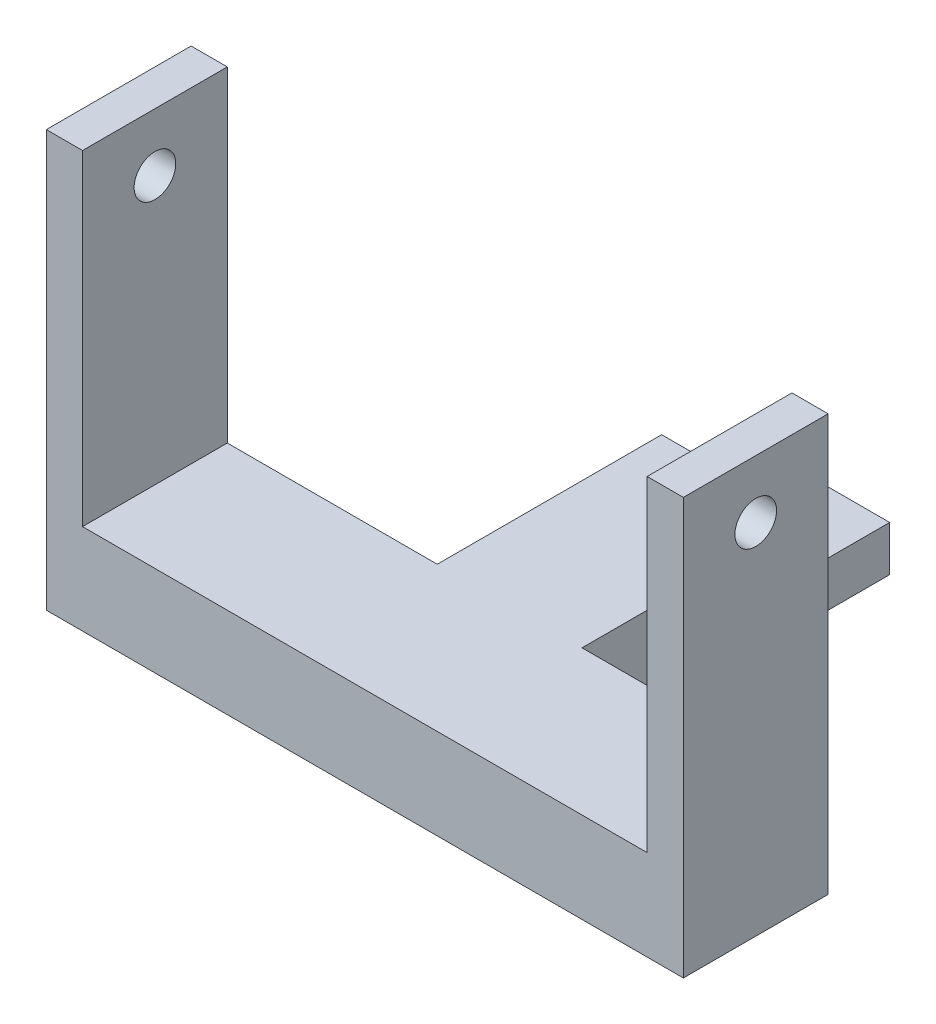
ISO-10303-21;
HEADER;
FILE_DESCRIPTION(('STEP AP214'),'2;1');
FILE_NAME('part.step','',(''),(''),'','','');
FILE_SCHEMA(('AUTOMOTIVE_DESIGN { 1 0 10303 214 1 1 1 1 }'));
ENDSEC;
DATA;
#1=APPLICATION_CONTEXT('core data for automotive mechanical design processes');
#2=APPLICATION_PROTOCOL_DEFINITION('international standard','automotive_design',2000,#1);
#3=PRODUCT_CONTEXT('',#1,'mechanical');
#4=PRODUCT('Part','Part','',(#3));
#5=PRODUCT_RELATED_PRODUCT_CATEGORY('part','',(#4));
#6=PRODUCT_DEFINITION_FORMATION('','',#4);
#7=PRODUCT_DEFINITION_CONTEXT('part definition',#1,'design');
#8=PRODUCT_DEFINITION('design','',#6,#7);
#9=PRODUCT_DEFINITION_SHAPE('','',#8);
#10=(LENGTH_UNIT() NAMED_UNIT(*) SI_UNIT(.MILLI.,.METRE.));
#11=(NAMED_UNIT(*) PLANE_ANGLE_UNIT() SI_UNIT($,.RADIAN.));
#12=(NAMED_UNIT(*) SI_UNIT($,.STERADIAN.) SOLID_ANGLE_UNIT());
#13=UNCERTAINTY_MEASURE_WITH_UNIT(LENGTH_MEASURE(1.E-05),#10,'distance_accuracy_value','');
#14=(GEOMETRIC_REPRESENTATION_CONTEXT(3) GLOBAL_UNCERTAINTY_ASSIGNED_CONTEXT((#13)) GLOBAL_UNIT_ASSIGNED_CONTEXT((#10,
#11,#12)) REPRESENTATION_CONTEXT('',''));
#15=CARTESIAN_POINT('',(0.,0.,0.));
#16=DIRECTION('',(0.,0.,1.));
#17=DIRECTION('',(1.,0.,0.));
#18=AXIS2_PLACEMENT_3D('',#15,#16,#17);
#19=CARTESIAN_POINT('',(88.,20.,-20.));
#20=DIRECTION('',(0.,0.,1.));
#21=DIRECTION('',(1.,0.,0.));
#22=AXIS2_PLACEMENT_3D('',#19,#20,#21);
#23=PLANE('',#22);
#24=DIRECTION('',(-1.,0.,0.));
#25=VECTOR('',#24,1.);
#26=CARTESIAN_POINT('',(-78.,10.,-20.));
#27=LINE('',#26,#25);
#28=CARTESIAN_POINT('',(78.,10.,-20.));
#29=VERTEX_POINT('',#28);
#30=CARTESIAN_POINT('',(20.,10.,-20.));
#31=VERTEX_POINT('',#30);
#32=EDGE_CURVE('E166',#29,#31,#27,.T.);
#33=ORIENTED_EDGE('',*,*,#32,.F.);
#34=DIRECTION('',(0.,1.,0.));
#35=VECTOR('',#34,1.);
#36=CARTESIAN_POINT('',(78.,20.,-20.));
#37=LINE('',#36,#35);
#38=CARTESIAN_POINT('',(78.,100.,-20.));
#39=VERTEX_POINT('',#38);
#40=EDGE_CURVE('E260',#29,#39,#37,.T.);
#41=ORIENTED_EDGE('',*,*,#40,.T.);
#42=DIRECTION('',(-1.,0.,0.));
#43=VECTOR('',#42,1.);
#44=CARTESIAN_POINT('',(78.,100.,-20.));
#45=LINE('',#44,#43);
#46=CARTESIAN_POINT('',(88.,100.,-20.));
#47=VERTEX_POINT('',#46);
#48=EDGE_CURVE('E255',#47,#39,#45,.T.);
#49=ORIENTED_EDGE('',*,*,#48,.F.);
#50=DIRECTION('',(0.,1.,0.));
#51=VECTOR('',#50,1.);
#52=CARTESIAN_POINT('',(88.,20.,-20.));
#53=LINE('',#52,#51);
#54=CARTESIAN_POINT('',(88.,-15.,-20.));
#55=VERTEX_POINT('',#54);
#56=EDGE_CURVE('E210',#55,#47,#53,.T.);
#57=ORIENTED_EDGE('',*,*,#56,.F.);
#58=DIRECTION('',(1.,0.,0.));
#59=VECTOR('',#58,1.);
#60=CARTESIAN_POINT('',(20.,-15.,-20.));
#61=LINE('',#60,#59);
#62=CARTESIAN_POINT('',(20.,-15.,-20.));
#63=VERTEX_POINT('',#62);
#64=EDGE_CURVE('E173',#63,#55,#61,.T.);
#65=ORIENTED_EDGE('',*,*,#64,.F.);
#66=DIRECTION('',(0.,-1.,0.));
#67=VECTOR('',#66,1.);
#68=CARTESIAN_POINT('',(20.,-15.,-20.));
#69=LINE('',#68,#67);
#70=EDGE_CURVE('E198',#31,#63,#69,.T.);
#71=ORIENTED_EDGE('',*,*,#70,.F.);
#72=EDGE_LOOP('',(#33,#41,#49,#57,#65,#71));
#73=FACE_BOUND('',#72,.T.);
#74=ADVANCED_FACE('F35',(#73),#23,.F.);
#75=CARTESIAN_POINT('',(-20.,-15.,-20.));
#76=DIRECTION('',(1.,0.,0.));
#77=DIRECTION('',(0.,0.,-1.));
#78=AXIS2_PLACEMENT_3D('',#75,#76,#77);
#79=PLANE('',#78);
#80=DIRECTION('',(0.,0.,-1.));
#81=VECTOR('',#80,1.);
#82=CARTESIAN_POINT('',(-20.,-15.,-20.));
#83=LINE('',#82,#81);
#84=CARTESIAN_POINT('',(-20.,-15.,-20.));
#85=VERTEX_POINT('',#84);
#86=CARTESIAN_POINT('',(-20.,-15.,-105.));
#87=VERTEX_POINT('',#86);
#88=EDGE_CURVE('E215',#85,#87,#83,.T.);
#89=ORIENTED_EDGE('',*,*,#88,.F.);
#90=DIRECTION('',(0.,1.,0.));
#91=VECTOR('',#90,1.);
#92=CARTESIAN_POINT('',(-20.,-15.,-20.));
#93=LINE('',#92,#91);
#94=CARTESIAN_POINT('',(-20.,10.,-20.));
#95=VERTEX_POINT('',#94);
#96=EDGE_CURVE('E43',#85,#95,#93,.T.);
#97=ORIENTED_EDGE('',*,*,#96,.T.);
#98=DIRECTION('',(0.,0.,1.));
#99=VECTOR('',#98,1.);
#100=CARTESIAN_POINT('',(-20.,10.,-105.));
#101=LINE('',#100,#99);
#102=CARTESIAN_POINT('',(-20.,10.,-82.));
#103=VERTEX_POINT('',#102);
#104=EDGE_CURVE('E213',#103,#95,#101,.T.);
#105=ORIENTED_EDGE('',*,*,#104,.F.);
#106=DIRECTION('',(0.,-1.,0.));
#107=VECTOR('',#106,1.);
#108=CARTESIAN_POINT('',(-20.,10.,-82.));
#109=LINE('',#108,#107);
#110=CARTESIAN_POINT('',(-20.,-2.5,-82.));
#111=VERTEX_POINT('',#110);
#112=EDGE_CURVE('E185',#103,#111,#109,.T.);
#113=ORIENTED_EDGE('',*,*,#112,.T.);
#114=DIRECTION('',(0.,0.,1.));
#115=VECTOR('',#114,1.);
#116=CARTESIAN_POINT('',(-20.,-2.5,-105.));
#117=LINE('',#116,#115);
#118=CARTESIAN_POINT('',(-20.,-2.5,-105.));
#119=VERTEX_POINT('',#118);
#120=EDGE_CURVE('E188',#119,#111,#117,.T.);
#121=ORIENTED_EDGE('',*,*,#120,.F.);
#122=DIRECTION('',(0.,1.,0.));
#123=VECTOR('',#122,1.);
#124=CARTESIAN_POINT('',(-20.,-15.,-105.));
#125=LINE('',#124,#123);
#126=EDGE_CURVE('E204',#87,#119,#125,.T.);
#127=ORIENTED_EDGE('',*,*,#126,.F.);
#128=EDGE_LOOP('',(#89,#97,#105,#113,#121,#127));
#129=FACE_BOUND('',#128,.T.);
#130=ADVANCED_FACE('F283',(#129),#79,.F.);
#131=CARTESIAN_POINT('',(20.,-15.,-20.));
#132=DIRECTION('',(-1.,0.,0.));
#133=DIRECTION('',(0.,0.,1.));
#134=AXIS2_PLACEMENT_3D('',#131,#132,#133);
#135=PLANE('',#134);
#136=ORIENTED_EDGE('',*,*,#70,.T.);
#137=DIRECTION('',(0.,0.,1.));
#138=VECTOR('',#137,1.);
#139=CARTESIAN_POINT('',(20.,-15.,-20.));
#140=LINE('',#139,#138);
#141=CARTESIAN_POINT('',(20.,-15.,-105.));
#142=VERTEX_POINT('',#141);
#143=EDGE_CURVE('E217',#142,#63,#140,.T.);
#144=ORIENTED_EDGE('',*,*,#143,.F.);
#145=DIRECTION('',(0.,-1.,0.));
#146=VECTOR('',#145,1.);
#147=CARTESIAN_POINT('',(20.,-15.,-105.));
#148=LINE('',#147,#146);
#149=CARTESIAN_POINT('',(20.,-2.5,-105.));
#150=VERTEX_POINT('',#149);
#151=EDGE_CURVE('E199',#150,#142,#148,.T.);
#152=ORIENTED_EDGE('',*,*,#151,.F.);
#153=DIRECTION('',(0.,0.,1.));
#154=VECTOR('',#153,1.);
#155=CARTESIAN_POINT('',(20.,-2.5,-20.));
#156=LINE('',#155,#154);
#157=CARTESIAN_POINT('',(20.,-2.5,-82.));
#158=VERTEX_POINT('',#157);
#159=EDGE_CURVE('E57',#150,#158,#156,.T.);
#160=ORIENTED_EDGE('',*,*,#159,.T.);
#161=DIRECTION('',(0.,-1.,0.));
#162=VECTOR('',#161,1.);
#163=CARTESIAN_POINT('',(20.,-15.,-82.));
#164=LINE('',#163,#162);
#165=CARTESIAN_POINT('',(20.,10.,-82.));
#166=VERTEX_POINT('',#165);
#167=EDGE_CURVE('E196',#166,#158,#164,.T.);
#168=ORIENTED_EDGE('',*,*,#167,.F.);
#169=DIRECTION('',(0.,0.,1.));
#170=VECTOR('',#169,1.);
#171=CARTESIAN_POINT('',(20.,10.,-105.));
#172=LINE('',#171,#170);
#173=EDGE_CURVE('E207',#166,#31,#172,.T.);
#174=ORIENTED_EDGE('',*,*,#173,.T.);
#175=EDGE_LOOP('',(#136,#144,#152,#160,#168,#174));
#176=FACE_BOUND('',#175,.T.);
#177=ADVANCED_FACE('F290',(#176),#135,.F.);
#178=CARTESIAN_POINT('',(20.,10.,-105.));
#179=DIRECTION('',(0.,-1.,0.));
#180=DIRECTION('',(0.,0.,-1.));
#181=AXIS2_PLACEMENT_3D('',#178,#179,#180);
#182=PLANE('',#181);
#183=DIRECTION('',(-1.,0.,0.));
#184=VECTOR('',#183,1.);
#185=CARTESIAN_POINT('',(23.,10.,-82.));
#186=LINE('',#185,#184);
#187=EDGE_CURVE('E193',#166,#103,#186,.T.);
#188=ORIENTED_EDGE('',*,*,#187,.T.);
#189=ORIENTED_EDGE('',*,*,#104,.T.);
#190=CARTESIAN_POINT('',(-78.,10.,-20.));
#191=VERTEX_POINT('',#190);
#192=EDGE_CURVE('E157',#95,#191,#27,.T.);
#193=ORIENTED_EDGE('',*,*,#192,.T.);
#194=DIRECTION('',(0.,0.,1.));
#195=VECTOR('',#194,1.);
#196=CARTESIAN_POINT('',(-78.,10.,-20.));
#197=LINE('',#196,#195);
#198=CARTESIAN_POINT('',(-78.,10.,20.));
#199=VERTEX_POINT('',#198);
#200=EDGE_CURVE('E141',#191,#199,#197,.T.);
#201=ORIENTED_EDGE('',*,*,#200,.T.);
#202=DIRECTION('',(1.,0.,0.));
#203=VECTOR('',#202,1.);
#204=CARTESIAN_POINT('',(-78.,10.,20.));
#205=LINE('',#204,#203);
#206=CARTESIAN_POINT('',(78.,10.,20.));
#207=VERTEX_POINT('',#206);
#208=EDGE_CURVE('E155',#199,#207,#205,.T.);
#209=ORIENTED_EDGE('',*,*,#208,.T.);
#210=DIRECTION('',(0.,0.,-1.));
#211=VECTOR('',#210,1.);
#212=CARTESIAN_POINT('',(78.,10.,-20.));
#213=LINE('',#212,#211);
#214=EDGE_CURVE('E162',#207,#29,#213,.T.);
#215=ORIENTED_EDGE('',*,*,#214,.T.);
#216=ORIENTED_EDGE('',*,*,#32,.T.);
#217=ORIENTED_EDGE('',*,*,#173,.F.);
#218=EDGE_LOOP('',(#188,#189,#193,#201,#209,#215,#216,#217));
#219=FACE_BOUND('',#218,.T.);
#220=ADVANCED_FACE('F153',(#219),#182,.F.);
#221=DIRECTION('',(0.,-1.,0.));
#222=VECTOR('',#221,1.);
#223=CARTESIAN_POINT('',(-78.,100.,-20.));
#224=LINE('',#223,#222);
#225=CARTESIAN_POINT('',(-78.,100.,-20.));
#226=VERTEX_POINT('',#225);
#227=EDGE_CURVE('E147',#226,#191,#224,.T.);
#228=ORIENTED_EDGE('',*,*,#227,.T.);
#229=ORIENTED_EDGE('',*,*,#192,.F.);
#230=ORIENTED_EDGE('',*,*,#96,.F.);
#231=DIRECTION('',(1.,0.,0.));
#232=VECTOR('',#231,1.);
#233=CARTESIAN_POINT('',(-88.,-15.,-20.));
#234=LINE('',#233,#232);
#235=CARTESIAN_POINT('',(-88.,-15.,-20.));
#236=VERTEX_POINT('',#235);
#237=EDGE_CURVE('E171',#236,#85,#234,.T.);
#238=ORIENTED_EDGE('',*,*,#237,.F.);
#239=DIRECTION('',(0.,-1.,0.));
#240=VECTOR('',#239,1.);
#241=CARTESIAN_POINT('',(-88.,20.,-20.));
#242=LINE('',#241,#240);
#243=CARTESIAN_POINT('',(-88.,100.,-20.));
#244=VERTEX_POINT('',#243);
#245=EDGE_CURVE('E146',#244,#236,#242,.T.);
#246=ORIENTED_EDGE('',*,*,#245,.F.);
#247=DIRECTION('',(-1.,0.,0.));
#248=VECTOR('',#247,1.);
#249=CARTESIAN_POINT('',(-88.,100.,-20.));
#250=LINE('',#249,#248);
#251=EDGE_CURVE('E239',#226,#244,#250,.T.);
#252=ORIENTED_EDGE('',*,*,#251,.F.);
#253=EDGE_LOOP('',(#228,#229,#230,#238,#246,#252));
#254=FACE_BOUND('',#253,.T.);
#255=ADVANCED_FACE('F285',(#254),#23,.F.);
#256=CARTESIAN_POINT('',(78.,0.,0.));
#257=DIRECTION('',(1.,0.,0.));
#258=DIRECTION('',(0.,0.,-1.));
#259=AXIS2_PLACEMENT_3D('',#256,#257,#258);
#260=PLANE('',#259);
#261=CARTESIAN_POINT('',(78.,84.,0.));
#262=DIRECTION('',(1.,0.,0.));
#263=DIRECTION('',(0.,0.,-1.));
#264=AXIS2_PLACEMENT_3D('',#261,#262,#263);
#265=CIRCLE('',#264,5.75);
#266=CARTESIAN_POINT('',(78.,84.,-5.75));
#267=VERTEX_POINT('',#266);
#268=EDGE_CURVE('E230',#267,#267,#265,.T.);
#269=ORIENTED_EDGE('',*,*,#268,.T.);
#270=EDGE_LOOP('',(#269));
#271=FACE_BOUND('',#270,.T.);
#272=ORIENTED_EDGE('',*,*,#40,.F.);
#273=ORIENTED_EDGE('',*,*,#214,.F.);
#274=DIRECTION('',(0.,-1.,0.));
#275=VECTOR('',#274,1.);
#276=CARTESIAN_POINT('',(78.,20.,20.));
#277=LINE('',#276,#275);
#278=CARTESIAN_POINT('',(78.,100.,20.));
#279=VERTEX_POINT('',#278);
#280=EDGE_CURVE('E160',#279,#207,#277,.T.);
#281=ORIENTED_EDGE('',*,*,#280,.F.);
#282=DIRECTION('',(0.,0.,1.));
#283=VECTOR('',#282,1.);
#284=CARTESIAN_POINT('',(78.,100.,-20.));
#285=LINE('',#284,#283);
#286=EDGE_CURVE('E246',#39,#279,#285,.T.);
#287=ORIENTED_EDGE('',*,*,#286,.F.);
#288=EDGE_LOOP('',(#272,#273,#281,#287));
#289=FACE_BOUND('',#288,.T.);
#290=ADVANCED_FACE('F295',(#271,#289),#260,.F.);
#291=CARTESIAN_POINT('',(88.,20.,20.));
#292=DIRECTION('',(0.,0.,-1.));
#293=DIRECTION('',(-1.,0.,0.));
#294=AXIS2_PLACEMENT_3D('',#291,#292,#293);
#295=PLANE('',#294);
#296=ORIENTED_EDGE('',*,*,#208,.F.);
#297=DIRECTION('',(0.,-1.,0.));
#298=VECTOR('',#297,1.);
#299=CARTESIAN_POINT('',(-78.,100.,20.));
#300=LINE('',#299,#298);
#301=CARTESIAN_POINT('',(-78.,100.,20.));
#302=VERTEX_POINT('',#301);
#303=EDGE_CURVE('E137',#302,#199,#300,.T.);
#304=ORIENTED_EDGE('',*,*,#303,.F.);
#305=DIRECTION('',(1.,0.,0.));
#306=VECTOR('',#305,1.);
#307=CARTESIAN_POINT('',(-88.,100.,20.));
#308=LINE('',#307,#306);
#309=CARTESIAN_POINT('',(-88.,100.,20.));
#310=VERTEX_POINT('',#309);
#311=EDGE_CURVE('E236',#310,#302,#308,.T.);
#312=ORIENTED_EDGE('',*,*,#311,.F.);
#313=DIRECTION('',(0.,1.,0.));
#314=VECTOR('',#313,1.);
#315=CARTESIAN_POINT('',(-88.,20.,20.));
#316=LINE('',#315,#314);
#317=CARTESIAN_POINT('',(-88.,-15.,20.));
#318=VERTEX_POINT('',#317);
#319=EDGE_CURVE('E244',#318,#310,#316,.T.);
#320=ORIENTED_EDGE('',*,*,#319,.F.);
#321=DIRECTION('',(-1.,0.,0.));
#322=VECTOR('',#321,1.);
#323=CARTESIAN_POINT('',(20.,-15.,20.));
#324=LINE('',#323,#322);
#325=CARTESIAN_POINT('',(88.,-15.,20.));
#326=VERTEX_POINT('',#325);
#327=EDGE_CURVE('E220',#326,#318,#324,.T.);
#328=ORIENTED_EDGE('',*,*,#327,.F.);
#329=DIRECTION('',(0.,-1.,0.));
#330=VECTOR('',#329,1.);
#331=CARTESIAN_POINT('',(88.,20.,20.));
#332=LINE('',#331,#330);
#333=CARTESIAN_POINT('',(88.,100.,20.));
#334=VERTEX_POINT('',#333);
#335=EDGE_CURVE('E258',#334,#326,#332,.T.);
#336=ORIENTED_EDGE('',*,*,#335,.F.);
#337=DIRECTION('',(1.,0.,0.));
#338=VECTOR('',#337,1.);
#339=CARTESIAN_POINT('',(78.,100.,20.));
#340=LINE('',#339,#338);
#341=EDGE_CURVE('E249',#279,#334,#340,.T.);
#342=ORIENTED_EDGE('',*,*,#341,.F.);
#343=ORIENTED_EDGE('',*,*,#280,.T.);
#344=EDGE_LOOP('',(#296,#304,#312,#320,#328,#336,#342,#343));
#345=FACE_BOUND('',#344,.T.);
#346=ADVANCED_FACE('F37',(#345),#295,.F.);
#347=CARTESIAN_POINT('',(88.,0.,0.));
#348=DIRECTION('',(1.,0.,0.));
#349=DIRECTION('',(0.,0.,-1.));
#350=AXIS2_PLACEMENT_3D('',#347,#348,#349);
#351=PLANE('',#350);
#352=CARTESIAN_POINT('',(88.,84.,0.));
#353=DIRECTION('',(1.,0.,0.));
#354=DIRECTION('',(0.,0.,-1.));
#355=AXIS2_PLACEMENT_3D('',#352,#353,#354);
#356=CIRCLE('',#355,5.75);
#357=CARTESIAN_POINT('',(88.,84.,-5.75));
#358=VERTEX_POINT('',#357);
#359=EDGE_CURVE('E227',#358,#358,#356,.T.);
#360=ORIENTED_EDGE('',*,*,#359,.F.);
#361=EDGE_LOOP('',(#360));
#362=FACE_BOUND('',#361,.T.);
#363=ORIENTED_EDGE('',*,*,#335,.T.);
#364=DIRECTION('',(0.,0.,1.));
#365=VECTOR('',#364,1.);
#366=CARTESIAN_POINT('',(88.,-15.,20.));
#367=LINE('',#366,#365);
#368=EDGE_CURVE('E176',#55,#326,#367,.T.);
#369=ORIENTED_EDGE('',*,*,#368,.F.);
#370=ORIENTED_EDGE('',*,*,#56,.T.);
#371=DIRECTION('',(0.,0.,-1.));
#372=VECTOR('',#371,1.);
#373=CARTESIAN_POINT('',(88.,100.,-20.));
#374=LINE('',#373,#372);
#375=EDGE_CURVE('E252',#334,#47,#374,.T.);
#376=ORIENTED_EDGE('',*,*,#375,.F.);
#377=EDGE_LOOP('',(#363,#369,#370,#376));
#378=FACE_BOUND('',#377,.T.);
#379=ADVANCED_FACE('F314',(#362,#378),#351,.T.);
#380=CARTESIAN_POINT('',(0.,100.,0.));
#381=DIRECTION('',(0.,1.,0.));
#382=DIRECTION('',(0.,0.,1.));
#383=AXIS2_PLACEMENT_3D('',#380,#381,#382);
#384=PLANE('',#383);
#385=ORIENTED_EDGE('',*,*,#286,.T.);
#386=ORIENTED_EDGE('',*,*,#341,.T.);
#387=ORIENTED_EDGE('',*,*,#375,.T.);
#388=ORIENTED_EDGE('',*,*,#48,.T.);
#389=EDGE_LOOP('',(#385,#386,#387,#388));
#390=FACE_BOUND('',#389,.T.);
#391=ADVANCED_FACE('F317',(#390),#384,.T.);
#392=CARTESIAN_POINT('',(-88.,0.,0.));
#393=DIRECTION('',(-1.,0.,0.));
#394=DIRECTION('',(0.,0.,1.));
#395=AXIS2_PLACEMENT_3D('',#392,#393,#394);
#396=PLANE('',#395);
#397=CARTESIAN_POINT('',(-88.,84.,0.));
#398=DIRECTION('',(-1.,0.,0.));
#399=DIRECTION('',(0.,0.,1.));
#400=AXIS2_PLACEMENT_3D('',#397,#398,#399);
#401=CIRCLE('',#400,5.75);
#402=CARTESIAN_POINT('',(-88.,84.,5.75));
#403=VERTEX_POINT('',#402);
#404=EDGE_CURVE('E223',#403,#403,#401,.T.);
#405=ORIENTED_EDGE('',*,*,#404,.F.);
#406=EDGE_LOOP('',(#405));
#407=FACE_BOUND('',#406,.T.);
#408=ORIENTED_EDGE('',*,*,#245,.T.);
#409=DIRECTION('',(0.,0.,-1.));
#410=VECTOR('',#409,1.);
#411=CARTESIAN_POINT('',(-88.,-15.,20.));
#412=LINE('',#411,#410);
#413=EDGE_CURVE('E168',#318,#236,#412,.T.);
#414=ORIENTED_EDGE('',*,*,#413,.F.);
#415=ORIENTED_EDGE('',*,*,#319,.T.);
#416=DIRECTION('',(0.,0.,1.));
#417=VECTOR('',#416,1.);
#418=CARTESIAN_POINT('',(-88.,100.,-20.));
#419=LINE('',#418,#417);
#420=EDGE_CURVE('E233',#244,#310,#419,.T.);
#421=ORIENTED_EDGE('',*,*,#420,.F.);
#422=EDGE_LOOP('',(#408,#414,#415,#421));
#423=FACE_BOUND('',#422,.T.);
#424=ADVANCED_FACE('F307',(#407,#423),#396,.T.);
#425=CARTESIAN_POINT('',(-78.,100.,-20.));
#426=DIRECTION('',(-1.,0.,0.));
#427=DIRECTION('',(0.,0.,1.));
#428=AXIS2_PLACEMENT_3D('',#425,#426,#427);
#429=PLANE('',#428);
#430=CARTESIAN_POINT('',(-78.,84.,0.));
#431=DIRECTION('',(-1.,0.,0.));
#432=DIRECTION('',(0.,0.,1.));
#433=AXIS2_PLACEMENT_3D('',#430,#431,#432);
#434=CIRCLE('',#433,5.75);
#435=CARTESIAN_POINT('',(-78.,84.,5.75));
#436=VERTEX_POINT('',#435);
#437=EDGE_CURVE('E226',#436,#436,#434,.T.);
#438=ORIENTED_EDGE('',*,*,#437,.T.);
#439=EDGE_LOOP('',(#438));
#440=FACE_BOUND('',#439,.T.);
#441=ORIENTED_EDGE('',*,*,#303,.T.);
#442=ORIENTED_EDGE('',*,*,#200,.F.);
#443=ORIENTED_EDGE('',*,*,#227,.F.);
#444=DIRECTION('',(0.,0.,-1.));
#445=VECTOR('',#444,1.);
#446=CARTESIAN_POINT('',(-78.,100.,-20.));
#447=LINE('',#446,#445);
#448=EDGE_CURVE('E142',#302,#226,#447,.T.);
#449=ORIENTED_EDGE('',*,*,#448,.F.);
#450=EDGE_LOOP('',(#441,#442,#443,#449));
#451=FACE_BOUND('',#450,.T.);
#452=ADVANCED_FACE('F139',(#440,#451),#429,.F.);
#453=CARTESIAN_POINT('',(0.,100.,0.));
#454=DIRECTION('',(0.,1.,0.));
#455=DIRECTION('',(0.,0.,1.));
#456=AXIS2_PLACEMENT_3D('',#453,#454,#455);
#457=PLANE('',#456);
#458=ORIENTED_EDGE('',*,*,#420,.T.);
#459=ORIENTED_EDGE('',*,*,#311,.T.);
#460=ORIENTED_EDGE('',*,*,#448,.T.);
#461=ORIENTED_EDGE('',*,*,#251,.T.);
#462=EDGE_LOOP('',(#458,#459,#460,#461));
#463=FACE_BOUND('',#462,.T.);
#464=ADVANCED_FACE('F270',(#463),#457,.T.);
#465=CARTESIAN_POINT('',(106.,84.,0.));
#466=DIRECTION('',(-1.,0.,0.));
#467=DIRECTION('',(0.,0.,1.));
#468=AXIS2_PLACEMENT_3D('',#465,#466,#467);
#469=CYLINDRICAL_SURFACE('',#468,5.75);
#470=ORIENTED_EDGE('',*,*,#404,.T.);
#471=EDGE_LOOP('',(#470));
#472=FACE_BOUND('',#471,.T.);
#473=ORIENTED_EDGE('',*,*,#437,.F.);
#474=EDGE_LOOP('',(#473));
#475=FACE_BOUND('',#474,.T.);
#476=ADVANCED_FACE('F267',(#472,#475),#469,.F.);
#477=ORIENTED_EDGE('',*,*,#359,.T.);
#478=EDGE_LOOP('',(#477));
#479=FACE_BOUND('',#478,.T.);
#480=ORIENTED_EDGE('',*,*,#268,.F.);
#481=EDGE_LOOP('',(#480));
#482=FACE_BOUND('',#481,.T.);
#483=ADVANCED_FACE('F269',(#479,#482),#469,.F.);
#484=CARTESIAN_POINT('',(0.,-15.,0.));
#485=DIRECTION('',(0.,-1.,0.));
#486=DIRECTION('',(0.,0.,-1.));
#487=AXIS2_PLACEMENT_3D('',#484,#485,#486);
#488=PLANE('',#487);
#489=CARTESIAN_POINT('',(0.,-15.,-93.5));
#490=DIRECTION('',(0.,-1.,0.));
#491=DIRECTION('',(0.,0.,-1.));
#492=AXIS2_PLACEMENT_3D('',#489,#490,#491);
#493=CIRCLE('',#492,2.1);
#494=CARTESIAN_POINT('',(0.,-15.,-95.6));
#495=VERTEX_POINT('',#494);
#496=EDGE_CURVE('E182',#495,#495,#493,.T.);
#497=ORIENTED_EDGE('',*,*,#496,.F.);
#498=EDGE_LOOP('',(#497));
#499=FACE_BOUND('',#498,.T.);
#500=ORIENTED_EDGE('',*,*,#327,.T.);
#501=ORIENTED_EDGE('',*,*,#413,.T.);
#502=ORIENTED_EDGE('',*,*,#237,.T.);
#503=ORIENTED_EDGE('',*,*,#88,.T.);
#504=DIRECTION('',(-1.,0.,0.));
#505=VECTOR('',#504,1.);
#506=CARTESIAN_POINT('',(20.,-15.,-105.));
#507=LINE('',#506,#505);
#508=EDGE_CURVE('E201',#142,#87,#507,.T.);
#509=ORIENTED_EDGE('',*,*,#508,.F.);
#510=ORIENTED_EDGE('',*,*,#143,.T.);
#511=ORIENTED_EDGE('',*,*,#64,.T.);
#512=ORIENTED_EDGE('',*,*,#368,.T.);
#513=EDGE_LOOP('',(#500,#501,#502,#503,#509,#510,#511,#512));
#514=FACE_BOUND('',#513,.T.);
#515=ADVANCED_FACE('F277',(#499,#514),#488,.T.);
#516=CARTESIAN_POINT('',(0.,0.,-105.));
#517=DIRECTION('',(0.,0.,1.));
#518=DIRECTION('',(1.,0.,0.));
#519=AXIS2_PLACEMENT_3D('',#516,#517,#518);
#520=PLANE('',#519);
#521=ORIENTED_EDGE('',*,*,#126,.T.);
#522=DIRECTION('',(1.,0.,0.));
#523=VECTOR('',#522,1.);
#524=CARTESIAN_POINT('',(0.,-2.5,-105.));
#525=LINE('',#524,#523);
#526=EDGE_CURVE('E11',#119,#150,#525,.T.);
#527=ORIENTED_EDGE('',*,*,#526,.T.);
#528=ORIENTED_EDGE('',*,*,#151,.T.);
#529=ORIENTED_EDGE('',*,*,#508,.T.);
#530=EDGE_LOOP('',(#521,#527,#528,#529));
#531=FACE_BOUND('',#530,.T.);
#532=ADVANCED_FACE('F334',(#531),#520,.F.);
#533=CARTESIAN_POINT('',(23.,10.,-82.));
#534=DIRECTION('',(0.,0.,-1.));
#535=DIRECTION('',(-1.,0.,0.));
#536=AXIS2_PLACEMENT_3D('',#533,#534,#535);
#537=PLANE('',#536);
#538=ORIENTED_EDGE('',*,*,#167,.T.);
#539=DIRECTION('',(-1.,0.,0.));
#540=VECTOR('',#539,1.);
#541=CARTESIAN_POINT('',(23.,-2.5,-82.));
#542=LINE('',#541,#540);
#543=EDGE_CURVE('E191',#158,#111,#542,.T.);
#544=ORIENTED_EDGE('',*,*,#543,.T.);
#545=ORIENTED_EDGE('',*,*,#112,.F.);
#546=ORIENTED_EDGE('',*,*,#187,.F.);
#547=EDGE_LOOP('',(#538,#544,#545,#546));
#548=FACE_BOUND('',#547,.T.);
#549=ADVANCED_FACE('F336',(#548),#537,.T.);
#550=CARTESIAN_POINT('',(23.,-2.5,-105.));
#551=DIRECTION('',(0.,-1.,0.));
#552=DIRECTION('',(0.,0.,-1.));
#553=AXIS2_PLACEMENT_3D('',#550,#551,#552);
#554=PLANE('',#553);
#555=CARTESIAN_POINT('',(0.,-2.5,-93.5));
#556=DIRECTION('',(0.,1.,0.));
#557=DIRECTION('',(0.,0.,1.));
#558=AXIS2_PLACEMENT_3D('',#555,#556,#557);
#559=CIRCLE('',#558,2.1);
#560=CARTESIAN_POINT('',(0.,-2.5,-91.4));
#561=VERTEX_POINT('',#560);
#562=EDGE_CURVE('E179',#561,#561,#559,.T.);
#563=ORIENTED_EDGE('',*,*,#562,.F.);
#564=EDGE_LOOP('',(#563));
#565=FACE_BOUND('',#564,.T.);
#566=ORIENTED_EDGE('',*,*,#526,.F.);
#567=ORIENTED_EDGE('',*,*,#120,.T.);
#568=ORIENTED_EDGE('',*,*,#543,.F.);
#569=ORIENTED_EDGE('',*,*,#159,.F.);
#570=EDGE_LOOP('',(#566,#567,#568,#569));
#571=FACE_BOUND('',#570,.T.);
#572=ADVANCED_FACE('F335',(#565,#571),#554,.F.);
#573=CARTESIAN_POINT('',(0.,-45.5,-93.5));
#574=DIRECTION('',(0.,1.,0.));
#575=DIRECTION('',(0.,0.,1.));
#576=AXIS2_PLACEMENT_3D('',#573,#574,#575);
#577=CYLINDRICAL_SURFACE('',#576,2.1);
#578=ORIENTED_EDGE('',*,*,#496,.T.);
#579=EDGE_LOOP('',(#578));
#580=FACE_BOUND('',#579,.T.);
#581=ORIENTED_EDGE('',*,*,#562,.T.);
#582=EDGE_LOOP('',(#581));
#583=FACE_BOUND('',#582,.T.);
#584=ADVANCED_FACE('F343',(#580,#583),#577,.F.);
#585=CLOSED_SHELL('',(#74,#130,#177,#220,#255,#290,#346,#379,#391,#424,#452,#464,#476,#483,#515,
#532,#549,#572,#584));
#586=MANIFOLD_SOLID_BREP('B2',#585);
#587=ADVANCED_BREP_SHAPE_REPRESENTATION('',(#18,#586),#14);
#588=SHAPE_DEFINITION_REPRESENTATION(#9,#587);
ENDSEC;
END-ISO-10303-21;
